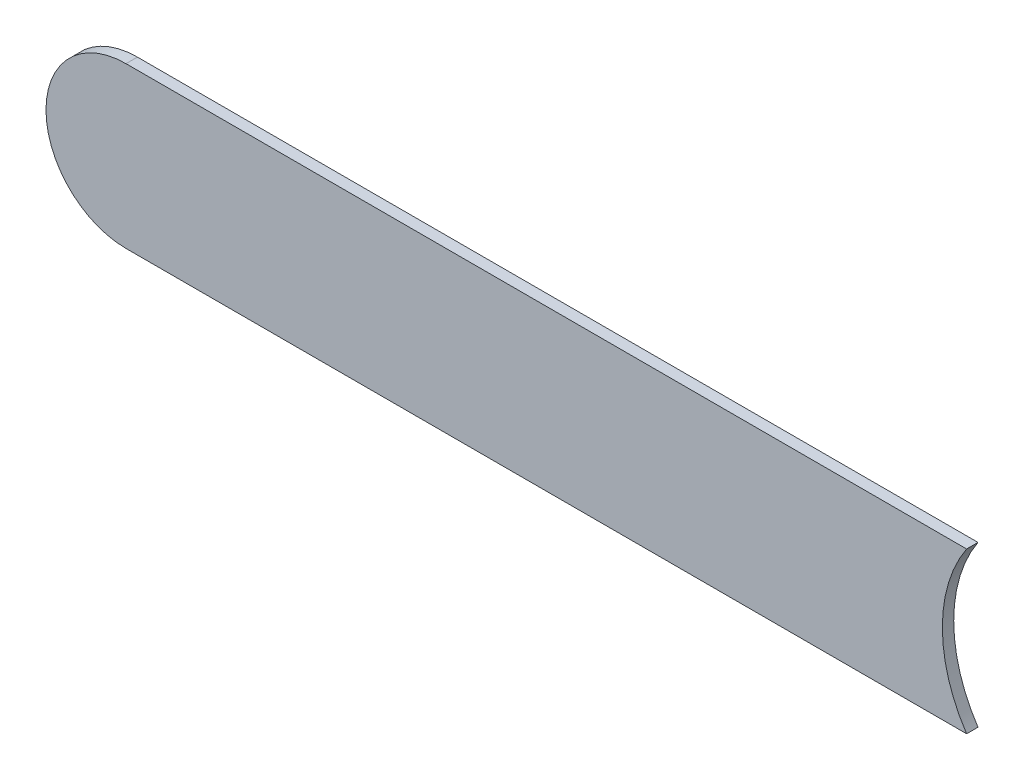
ISO-10303-21;
HEADER;
FILE_DESCRIPTION(('STEP AP214'),'2;1');
FILE_NAME('part.step','',(''),(''),'','','');
FILE_SCHEMA(('AUTOMOTIVE_DESIGN { 1 0 10303 214 1 1 1 1 }'));
ENDSEC;
DATA;
#1=APPLICATION_CONTEXT('core data for automotive mechanical design processes');
#2=APPLICATION_PROTOCOL_DEFINITION('international standard','automotive_design',2000,#1);
#3=PRODUCT_CONTEXT('',#1,'mechanical');
#4=PRODUCT('Part','Part','',(#3));
#5=PRODUCT_RELATED_PRODUCT_CATEGORY('part','',(#4));
#6=PRODUCT_DEFINITION_FORMATION('','',#4);
#7=PRODUCT_DEFINITION_CONTEXT('part definition',#1,'design');
#8=PRODUCT_DEFINITION('design','',#6,#7);
#9=PRODUCT_DEFINITION_SHAPE('','',#8);
#10=(LENGTH_UNIT() NAMED_UNIT(*) SI_UNIT(.MILLI.,.METRE.));
#11=(NAMED_UNIT(*) PLANE_ANGLE_UNIT() SI_UNIT($,.RADIAN.));
#12=(NAMED_UNIT(*) SI_UNIT($,.STERADIAN.) SOLID_ANGLE_UNIT());
#13=UNCERTAINTY_MEASURE_WITH_UNIT(LENGTH_MEASURE(1.E-05),#10,'distance_accuracy_value','');
#14=(GEOMETRIC_REPRESENTATION_CONTEXT(3) GLOBAL_UNCERTAINTY_ASSIGNED_CONTEXT((#13)) GLOBAL_UNIT_ASSIGNED_CONTEXT((#10,
#11,#12)) REPRESENTATION_CONTEXT('',''));
#15=CARTESIAN_POINT('',(0.,0.,0.));
#16=DIRECTION('',(0.,0.,1.));
#17=DIRECTION('',(1.,0.,0.));
#18=AXIS2_PLACEMENT_3D('',#15,#16,#17);
#19=CARTESIAN_POINT('',(114.2999873,81.8500141,0.));
#20=DIRECTION('',(0.,1.,0.));
#21=DIRECTION('',(1.,0.,0.));
#22=AXIS2_PLACEMENT_3D('',#19,#20,#21);
#23=PLANE('',#22);
#24=DIRECTION('',(1.,0.,0.));
#25=VECTOR('',#24,1.);
#26=CARTESIAN_POINT('',(114.2999873,81.8500141,0.03556));
#27=LINE('',#26,#25);
#28=CARTESIAN_POINT('',(114.2999873,81.8500141,0.03556));
#29=VERTEX_POINT('',#28);
#30=CARTESIAN_POINT('',(116.925829009654,81.8500141,0.03556));
#31=VERTEX_POINT('',#30);
#32=EDGE_CURVE('E11',#29,#31,#27,.T.);
#33=ORIENTED_EDGE('',*,*,#32,.F.);
#34=DIRECTION('',(0.,0.,1.));
#35=VECTOR('',#34,1.);
#36=CARTESIAN_POINT('',(114.2999873,81.8500141,0.));
#37=LINE('',#36,#35);
#38=CARTESIAN_POINT('',(114.2999873,81.8500141,0.));
#39=VERTEX_POINT('',#38);
#40=EDGE_CURVE('E24',#39,#29,#37,.T.);
#41=ORIENTED_EDGE('',*,*,#40,.F.);
#42=DIRECTION('',(1.,0.,0.));
#43=VECTOR('',#42,1.);
#44=CARTESIAN_POINT('',(114.2999873,81.8500141,0.));
#45=LINE('',#44,#43);
#46=CARTESIAN_POINT('',(116.925829009654,81.8500141,0.));
#47=VERTEX_POINT('',#46);
#48=EDGE_CURVE('E75',#39,#47,#45,.T.);
#49=ORIENTED_EDGE('',*,*,#48,.T.);
#50=DIRECTION('',(0.,0.,1.));
#51=VECTOR('',#50,1.);
#52=CARTESIAN_POINT('',(116.925829009654,81.8500141,0.));
#53=LINE('',#52,#51);
#54=EDGE_CURVE('E37',#47,#31,#53,.T.);
#55=ORIENTED_EDGE('',*,*,#54,.T.);
#56=EDGE_LOOP('',(#33,#41,#49,#55));
#57=FACE_BOUND('',#56,.T.);
#58=ADVANCED_FACE('F17',(#57),#23,.F.);
#59=CARTESIAN_POINT('',(117.299994,82.1000136,0.));
#60=DIRECTION('',(0.,0.,-1.));
#61=DIRECTION('',(1.,0.,0.));
#62=AXIS2_PLACEMENT_3D('',#59,#60,#61);
#63=CYLINDRICAL_SURFACE('',#62,0.4499991);
#64=DIRECTION('',(0.,0.,1.));
#65=VECTOR('',#64,1.);
#66=CARTESIAN_POINT('',(116.925829009654,82.3500131,0.));
#67=LINE('',#66,#65);
#68=CARTESIAN_POINT('',(116.925829009654,82.3500131,0.));
#69=VERTEX_POINT('',#68);
#70=CARTESIAN_POINT('',(116.925829009654,82.3500131,0.03556));
#71=VERTEX_POINT('',#70);
#72=EDGE_CURVE('E67',#69,#71,#67,.T.);
#73=ORIENTED_EDGE('',*,*,#72,.T.);
#74=CARTESIAN_POINT('',(117.299994,82.1000136,0.03556));
#75=DIRECTION('',(0.,0.,1.));
#76=DIRECTION('',(1.,0.,0.));
#77=AXIS2_PLACEMENT_3D('',#74,#75,#76);
#78=CIRCLE('',#77,0.4499991);
#79=EDGE_CURVE('E82',#71,#31,#78,.T.);
#80=ORIENTED_EDGE('',*,*,#79,.T.);
#81=ORIENTED_EDGE('',*,*,#54,.F.);
#82=CARTESIAN_POINT('',(117.299994,82.1000136,0.));
#83=DIRECTION('',(0.,0.,1.));
#84=DIRECTION('',(1.,0.,0.));
#85=AXIS2_PLACEMENT_3D('',#82,#83,#84);
#86=CIRCLE('',#85,0.4499991);
#87=EDGE_CURVE('E80',#69,#47,#86,.T.);
#88=ORIENTED_EDGE('',*,*,#87,.F.);
#89=EDGE_LOOP('',(#73,#80,#81,#88));
#90=FACE_BOUND('',#89,.T.);
#91=ADVANCED_FACE('F88',(#90),#63,.F.);
#92=CARTESIAN_POINT('',(116.925829009654,82.3500131,0.));
#93=DIRECTION('',(0.,-1.,0.));
#94=DIRECTION('',(-1.,0.,0.));
#95=AXIS2_PLACEMENT_3D('',#92,#93,#94);
#96=PLANE('',#95);
#97=DIRECTION('',(-1.,0.,0.));
#98=VECTOR('',#97,1.);
#99=CARTESIAN_POINT('',(117.299994,82.3500131,0.03556));
#100=LINE('',#99,#98);
#101=CARTESIAN_POINT('',(114.2999873,82.3500131,0.03556));
#102=VERTEX_POINT('',#101);
#103=EDGE_CURVE('E71',#71,#102,#100,.T.);
#104=ORIENTED_EDGE('',*,*,#103,.F.);
#105=ORIENTED_EDGE('',*,*,#72,.F.);
#106=DIRECTION('',(-1.,0.,0.));
#107=VECTOR('',#106,1.);
#108=CARTESIAN_POINT('',(117.299994,82.3500131,0.));
#109=LINE('',#108,#107);
#110=CARTESIAN_POINT('',(114.2999873,82.3500131,0.));
#111=VERTEX_POINT('',#110);
#112=EDGE_CURVE('E63',#69,#111,#109,.T.);
#113=ORIENTED_EDGE('',*,*,#112,.T.);
#114=DIRECTION('',(0.,0.,1.));
#115=VECTOR('',#114,1.);
#116=CARTESIAN_POINT('',(114.2999873,82.3500131,0.));
#117=LINE('',#116,#115);
#118=EDGE_CURVE('E53',#111,#102,#117,.T.);
#119=ORIENTED_EDGE('',*,*,#118,.T.);
#120=EDGE_LOOP('',(#104,#105,#113,#119));
#121=FACE_BOUND('',#120,.T.);
#122=ADVANCED_FACE('F66',(#121),#96,.F.);
#123=CARTESIAN_POINT('',(114.2999873,82.1000136,0.));
#124=DIRECTION('',(0.,0.,-1.));
#125=DIRECTION('',(-1.13687065095746E-13,1.,0.));
#126=AXIS2_PLACEMENT_3D('',#123,#124,#125);
#127=CYLINDRICAL_SURFACE('',#126,0.249999500000006);
#128=CARTESIAN_POINT('',(114.2999873,82.1000136,0.03556));
#129=DIRECTION('',(0.,0.,1.));
#130=DIRECTION('',(-1.13687065095746E-13,1.,0.));
#131=AXIS2_PLACEMENT_3D('',#128,#129,#130);
#132=CIRCLE('',#131,0.249999500000006);
#133=EDGE_CURVE('E59',#102,#29,#132,.T.);
#134=ORIENTED_EDGE('',*,*,#133,.F.);
#135=ORIENTED_EDGE('',*,*,#118,.F.);
#136=CARTESIAN_POINT('',(114.2999873,82.1000136,0.));
#137=DIRECTION('',(0.,0.,1.));
#138=DIRECTION('',(-1.13687065095746E-13,1.,0.));
#139=AXIS2_PLACEMENT_3D('',#136,#137,#138);
#140=CIRCLE('',#139,0.249999500000006);
#141=EDGE_CURVE('E57',#111,#39,#140,.T.);
#142=ORIENTED_EDGE('',*,*,#141,.T.);
#143=ORIENTED_EDGE('',*,*,#40,.T.);
#144=EDGE_LOOP('',(#134,#135,#142,#143));
#145=FACE_BOUND('',#144,.T.);
#146=ADVANCED_FACE('F55',(#145),#127,.T.);
#147=CARTESIAN_POINT('',(114.2999873,81.8500141,0.));
#148=DIRECTION('',(0.,0.,-1.));
#149=DIRECTION('',(-1.,0.,0.));
#150=AXIS2_PLACEMENT_3D('',#147,#148,#149);
#151=PLANE('',#150);
#152=ORIENTED_EDGE('',*,*,#48,.F.);
#153=ORIENTED_EDGE('',*,*,#141,.F.);
#154=ORIENTED_EDGE('',*,*,#112,.F.);
#155=ORIENTED_EDGE('',*,*,#87,.T.);
#156=EDGE_LOOP('',(#152,#153,#154,#155));
#157=FACE_BOUND('',#156,.T.);
#158=ADVANCED_FACE('F74',(#157),#151,.T.);
#159=CARTESIAN_POINT('',(114.2999873,81.8500141,0.03556));
#160=DIRECTION('',(0.,0.,-1.));
#161=DIRECTION('',(-1.,0.,0.));
#162=AXIS2_PLACEMENT_3D('',#159,#160,#161);
#163=PLANE('',#162);
#164=ORIENTED_EDGE('',*,*,#133,.T.);
#165=ORIENTED_EDGE('',*,*,#32,.T.);
#166=ORIENTED_EDGE('',*,*,#79,.F.);
#167=ORIENTED_EDGE('',*,*,#103,.T.);
#168=EDGE_LOOP('',(#164,#165,#166,#167));
#169=FACE_BOUND('',#168,.T.);
#170=ADVANCED_FACE('F91',(#169),#163,.F.);
#171=CLOSED_SHELL('',(#58,#91,#122,#146,#158,#170));
#172=MANIFOLD_SOLID_BREP('B1',#171);
#173=ADVANCED_BREP_SHAPE_REPRESENTATION('',(#18,#172),#14);
#174=SHAPE_DEFINITION_REPRESENTATION(#9,#173);
ENDSEC;
END-ISO-10303-21;
